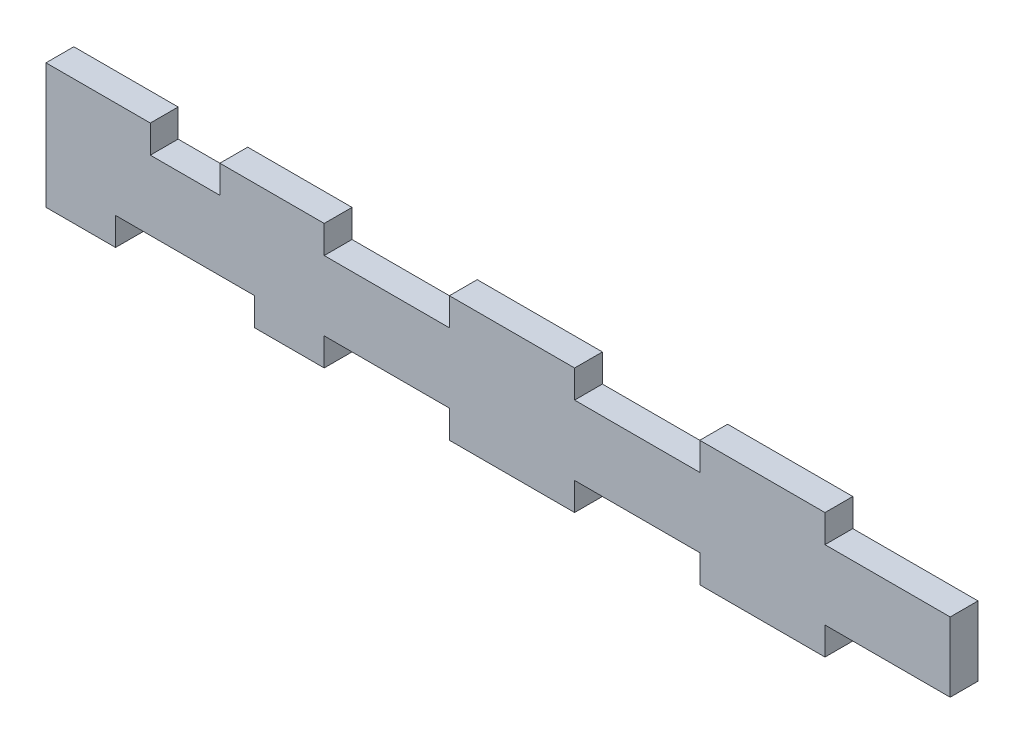
ISO-10303-21;
HEADER;
FILE_DESCRIPTION(('STEP AP214'),'2;1');
FILE_NAME('part.step','',(''),(''),'','','');
FILE_SCHEMA(('AUTOMOTIVE_DESIGN { 1 0 10303 214 1 1 1 1 }'));
ENDSEC;
DATA;
#1=APPLICATION_CONTEXT('core data for automotive mechanical design processes');
#2=APPLICATION_PROTOCOL_DEFINITION('international standard','automotive_design',2000,#1);
#3=PRODUCT_CONTEXT('',#1,'mechanical');
#4=PRODUCT('Part','Part','',(#3));
#5=PRODUCT_RELATED_PRODUCT_CATEGORY('part','',(#4));
#6=PRODUCT_DEFINITION_FORMATION('','',#4);
#7=PRODUCT_DEFINITION_CONTEXT('part definition',#1,'design');
#8=PRODUCT_DEFINITION('design','',#6,#7);
#9=PRODUCT_DEFINITION_SHAPE('','',#8);
#10=(LENGTH_UNIT() NAMED_UNIT(*) SI_UNIT(.MILLI.,.METRE.));
#11=(NAMED_UNIT(*) PLANE_ANGLE_UNIT() SI_UNIT($,.RADIAN.));
#12=(NAMED_UNIT(*) SI_UNIT($,.STERADIAN.) SOLID_ANGLE_UNIT());
#13=UNCERTAINTY_MEASURE_WITH_UNIT(LENGTH_MEASURE(1.E-05),#10,'distance_accuracy_value','');
#14=(GEOMETRIC_REPRESENTATION_CONTEXT(3) GLOBAL_UNCERTAINTY_ASSIGNED_CONTEXT((#13)) GLOBAL_UNIT_ASSIGNED_CONTEXT((#10,
#11,#12)) REPRESENTATION_CONTEXT('',''));
#15=CARTESIAN_POINT('',(0.,0.,0.));
#16=DIRECTION('',(0.,0.,1.));
#17=DIRECTION('',(1.,0.,0.));
#18=AXIS2_PLACEMENT_3D('',#15,#16,#17);
#19=CARTESIAN_POINT('',(-20.,-20.,2.));
#20=DIRECTION('',(0.,1.,0.));
#21=DIRECTION('',(0.,0.,1.));
#22=AXIS2_PLACEMENT_3D('',#19,#20,#21);
#23=PLANE('',#22);
#24=DIRECTION('',(1.,0.,0.));
#25=VECTOR('',#24,1.);
#26=CARTESIAN_POINT('',(-20.,-20.,-2.));
#27=LINE('',#26,#25);
#28=CARTESIAN_POINT('',(-10.,-20.,-2.));
#29=VERTEX_POINT('',#28);
#30=CARTESIAN_POINT('',(9.99999999999999,-20.,-2.));
#31=VERTEX_POINT('',#30);
#32=EDGE_CURVE('E50',#29,#31,#27,.T.);
#33=ORIENTED_EDGE('',*,*,#32,.T.);
#34=DIRECTION('',(0.,0.,1.));
#35=VECTOR('',#34,1.);
#36=CARTESIAN_POINT('',(9.99999999999999,-20.,-2.));
#37=LINE('',#36,#35);
#38=CARTESIAN_POINT('',(9.99999999999999,-20.,2.));
#39=VERTEX_POINT('',#38);
#40=EDGE_CURVE('E446',#31,#39,#37,.T.);
#41=ORIENTED_EDGE('',*,*,#40,.T.);
#42=DIRECTION('',(1.,0.,0.));
#43=VECTOR('',#42,1.);
#44=CARTESIAN_POINT('',(-20.,-20.,2.));
#45=LINE('',#44,#43);
#46=CARTESIAN_POINT('',(-10.,-20.,2.));
#47=VERTEX_POINT('',#46);
#48=EDGE_CURVE('E11',#47,#39,#45,.T.);
#49=ORIENTED_EDGE('',*,*,#48,.F.);
#50=DIRECTION('',(0.,0.,1.));
#51=VECTOR('',#50,1.);
#52=CARTESIAN_POINT('',(-10.,-20.,-2.));
#53=LINE('',#52,#51);
#54=EDGE_CURVE('E475',#29,#47,#53,.T.);
#55=ORIENTED_EDGE('',*,*,#54,.F.);
#56=EDGE_LOOP('',(#33,#41,#49,#55));
#57=FACE_BOUND('',#56,.T.);
#58=ADVANCED_FACE('F46',(#57),#23,.F.);
#59=CARTESIAN_POINT('',(20.,-20.,2.));
#60=DIRECTION('',(-1.,0.,0.));
#61=DIRECTION('',(0.,0.,1.));
#62=AXIS2_PLACEMENT_3D('',#59,#60,#61);
#63=PLANE('',#62);
#64=DIRECTION('',(0.,1.,0.));
#65=VECTOR('',#64,1.);
#66=CARTESIAN_POINT('',(20.,-20.,-2.));
#67=LINE('',#66,#65);
#68=CARTESIAN_POINT('',(20.,-24.,-2.));
#69=VERTEX_POINT('',#68);
#70=CARTESIAN_POINT('',(20.,-20.,-2.));
#71=VERTEX_POINT('',#70);
#72=EDGE_CURVE('E68',#69,#71,#67,.T.);
#73=ORIENTED_EDGE('',*,*,#72,.T.);
#74=DIRECTION('',(0.,0.,1.));
#75=VECTOR('',#74,1.);
#76=CARTESIAN_POINT('',(20.,-20.,-2.));
#77=LINE('',#76,#75);
#78=CARTESIAN_POINT('',(20.,-20.,2.));
#79=VERTEX_POINT('',#78);
#80=EDGE_CURVE('E63',#71,#79,#77,.T.);
#81=ORIENTED_EDGE('',*,*,#80,.T.);
#82=DIRECTION('',(0.,1.,0.));
#83=VECTOR('',#82,1.);
#84=CARTESIAN_POINT('',(20.,-20.,2.));
#85=LINE('',#84,#83);
#86=CARTESIAN_POINT('',(20.,-24.,2.));
#87=VERTEX_POINT('',#86);
#88=EDGE_CURVE('E264',#87,#79,#85,.T.);
#89=ORIENTED_EDGE('',*,*,#88,.F.);
#90=DIRECTION('',(0.,0.,1.));
#91=VECTOR('',#90,1.);
#92=CARTESIAN_POINT('',(20.,-24.,-2.));
#93=LINE('',#92,#91);
#94=EDGE_CURVE('E408',#69,#87,#93,.T.);
#95=ORIENTED_EDGE('',*,*,#94,.F.);
#96=EDGE_LOOP('',(#73,#81,#89,#95));
#97=FACE_BOUND('',#96,.T.);
#98=ADVANCED_FACE('F48',(#97),#63,.F.);
#99=CARTESIAN_POINT('',(-20.,-20.,2.));
#100=DIRECTION('',(1.,0.,0.));
#101=DIRECTION('',(0.,0.,-1.));
#102=AXIS2_PLACEMENT_3D('',#99,#100,#101);
#103=PLANE('',#102);
#104=DIRECTION('',(0.,-1.,0.));
#105=VECTOR('',#104,1.);
#106=CARTESIAN_POINT('',(-20.,-20.,2.));
#107=LINE('',#106,#105);
#108=CARTESIAN_POINT('',(-19.9999999999998,-6.,2.));
#109=VERTEX_POINT('',#108);
#110=CARTESIAN_POINT('',(-20.,-24.,2.));
#111=VERTEX_POINT('',#110);
#112=EDGE_CURVE('E55',#109,#111,#107,.T.);
#113=ORIENTED_EDGE('',*,*,#112,.F.);
#114=DIRECTION('',(0.,0.,1.));
#115=VECTOR('',#114,1.);
#116=CARTESIAN_POINT('',(-19.9999999999998,-6.,-2.));
#117=LINE('',#116,#115);
#118=CARTESIAN_POINT('',(-19.9999999999998,-6.,-2.));
#119=VERTEX_POINT('',#118);
#120=EDGE_CURVE('E258',#119,#109,#117,.T.);
#121=ORIENTED_EDGE('',*,*,#120,.F.);
#122=DIRECTION('',(0.,-1.,0.));
#123=VECTOR('',#122,1.);
#124=CARTESIAN_POINT('',(-20.,-20.,-2.));
#125=LINE('',#124,#123);
#126=CARTESIAN_POINT('',(-20.,-24.,-2.));
#127=VERTEX_POINT('',#126);
#128=EDGE_CURVE('E506',#119,#127,#125,.T.);
#129=ORIENTED_EDGE('',*,*,#128,.T.);
#130=DIRECTION('',(0.,0.,1.));
#131=VECTOR('',#130,1.);
#132=CARTESIAN_POINT('',(-20.,-24.,-2.));
#133=LINE('',#132,#131);
#134=EDGE_CURVE('E260',#127,#111,#133,.T.);
#135=ORIENTED_EDGE('',*,*,#134,.T.);
#136=EDGE_LOOP('',(#113,#121,#129,#135));
#137=FACE_BOUND('',#136,.T.);
#138=ADVANCED_FACE('F256',(#137),#103,.F.);
#139=CARTESIAN_POINT('',(0.,0.,2.));
#140=DIRECTION('',(0.,0.,-1.));
#141=DIRECTION('',(-1.,0.,0.));
#142=AXIS2_PLACEMENT_3D('',#139,#140,#141);
#143=PLANE('',#142);
#144=DIRECTION('',(1.,0.,0.));
#145=VECTOR('',#144,1.);
#146=CARTESIAN_POINT('',(-20.,-6.,2.));
#147=LINE('',#146,#145);
#148=CARTESIAN_POINT('',(-5.,-6.,2.));
#149=VERTEX_POINT('',#148);
#150=EDGE_CURVE('E267',#109,#149,#147,.T.);
#151=ORIENTED_EDGE('',*,*,#150,.F.);
#152=ORIENTED_EDGE('',*,*,#112,.T.);
#153=DIRECTION('',(1.,0.,0.));
#154=VECTOR('',#153,1.);
#155=CARTESIAN_POINT('',(-20.,-24.,2.));
#156=LINE('',#155,#154);
#157=CARTESIAN_POINT('',(-10.,-24.,2.));
#158=VERTEX_POINT('',#157);
#159=EDGE_CURVE('E460',#111,#158,#156,.T.);
#160=ORIENTED_EDGE('',*,*,#159,.T.);
#161=DIRECTION('',(0.,1.,0.));
#162=VECTOR('',#161,1.);
#163=CARTESIAN_POINT('',(-10.,-20.,2.));
#164=LINE('',#163,#162);
#165=EDGE_CURVE('E469',#158,#47,#164,.T.);
#166=ORIENTED_EDGE('',*,*,#165,.T.);
#167=ORIENTED_EDGE('',*,*,#48,.T.);
#168=DIRECTION('',(0.,-1.,0.));
#169=VECTOR('',#168,1.);
#170=CARTESIAN_POINT('',(9.99999999999999,-20.,2.));
#171=LINE('',#170,#169);
#172=CARTESIAN_POINT('',(9.99999999999999,-24.,2.));
#173=VERTEX_POINT('',#172);
#174=EDGE_CURVE('E456',#39,#173,#171,.T.);
#175=ORIENTED_EDGE('',*,*,#174,.T.);
#176=DIRECTION('',(1.,0.,0.));
#177=VECTOR('',#176,1.);
#178=CARTESIAN_POINT('',(20.,-24.,2.));
#179=LINE('',#178,#177);
#180=EDGE_CURVE('E453',#173,#87,#179,.T.);
#181=ORIENTED_EDGE('',*,*,#180,.T.);
#182=ORIENTED_EDGE('',*,*,#88,.T.);
#183=DIRECTION('',(1.,0.,0.));
#184=VECTOR('',#183,1.);
#185=CARTESIAN_POINT('',(20.,-20.,2.));
#186=LINE('',#185,#184);
#187=CARTESIAN_POINT('',(38.0000000000002,-20.,2.));
#188=VERTEX_POINT('',#187);
#189=EDGE_CURVE('E350',#79,#188,#186,.T.);
#190=ORIENTED_EDGE('',*,*,#189,.T.);
#191=DIRECTION('',(0.,-1.,0.));
#192=VECTOR('',#191,1.);
#193=CARTESIAN_POINT('',(38.0000000000002,-20.,2.));
#194=LINE('',#193,#192);
#195=CARTESIAN_POINT('',(38.0000000000002,-24.,2.));
#196=VERTEX_POINT('',#195);
#197=EDGE_CURVE('E353',#188,#196,#194,.T.);
#198=ORIENTED_EDGE('',*,*,#197,.T.);
#199=DIRECTION('',(1.,0.,0.));
#200=VECTOR('',#199,1.);
#201=CARTESIAN_POINT('',(38.0000000000002,-24.,2.));
#202=LINE('',#201,#200);
#203=CARTESIAN_POINT('',(56.0000000000002,-24.,2.));
#204=VERTEX_POINT('',#203);
#205=EDGE_CURVE('E356',#196,#204,#202,.T.);
#206=ORIENTED_EDGE('',*,*,#205,.T.);
#207=DIRECTION('',(0.,1.,0.));
#208=VECTOR('',#207,1.);
#209=CARTESIAN_POINT('',(56.0000000000002,-20.,2.));
#210=LINE('',#209,#208);
#211=CARTESIAN_POINT('',(56.0000000000002,-20.,2.));
#212=VERTEX_POINT('',#211);
#213=EDGE_CURVE('E359',#204,#212,#210,.T.);
#214=ORIENTED_EDGE('',*,*,#213,.T.);
#215=DIRECTION('',(1.,0.,0.));
#216=VECTOR('',#215,1.);
#217=CARTESIAN_POINT('',(56.0000000000002,-20.,2.));
#218=LINE('',#217,#216);
#219=CARTESIAN_POINT('',(74.0000000000002,-20.,2.));
#220=VERTEX_POINT('',#219);
#221=EDGE_CURVE('E362',#212,#220,#218,.T.);
#222=ORIENTED_EDGE('',*,*,#221,.T.);
#223=DIRECTION('',(0.,-1.,0.));
#224=VECTOR('',#223,1.);
#225=CARTESIAN_POINT('',(74.0000000000002,-20.,2.));
#226=LINE('',#225,#224);
#227=CARTESIAN_POINT('',(74.0000000000002,-24.,2.));
#228=VERTEX_POINT('',#227);
#229=EDGE_CURVE('E365',#220,#228,#226,.T.);
#230=ORIENTED_EDGE('',*,*,#229,.T.);
#231=DIRECTION('',(1.,0.,0.));
#232=VECTOR('',#231,1.);
#233=CARTESIAN_POINT('',(74.0000000000002,-24.,2.));
#234=LINE('',#233,#232);
#235=CARTESIAN_POINT('',(92.0000000000002,-24.,2.));
#236=VERTEX_POINT('',#235);
#237=EDGE_CURVE('E368',#228,#236,#234,.T.);
#238=ORIENTED_EDGE('',*,*,#237,.T.);
#239=DIRECTION('',(0.,1.,0.));
#240=VECTOR('',#239,1.);
#241=CARTESIAN_POINT('',(92.0000000000002,-20.,2.));
#242=LINE('',#241,#240);
#243=CARTESIAN_POINT('',(92.0000000000002,-20.,2.));
#244=VERTEX_POINT('',#243);
#245=EDGE_CURVE('E371',#236,#244,#242,.T.);
#246=ORIENTED_EDGE('',*,*,#245,.T.);
#247=DIRECTION('',(1.,0.,0.));
#248=VECTOR('',#247,1.);
#249=CARTESIAN_POINT('',(92.0000000000002,-20.,2.));
#250=LINE('',#249,#248);
#251=CARTESIAN_POINT('',(110.,-20.,2.));
#252=VERTEX_POINT('',#251);
#253=EDGE_CURVE('E374',#244,#252,#250,.T.);
#254=ORIENTED_EDGE('',*,*,#253,.T.);
#255=DIRECTION('',(0.,1.,0.));
#256=VECTOR('',#255,1.);
#257=CARTESIAN_POINT('',(110.,-20.,2.));
#258=LINE('',#257,#256);
#259=CARTESIAN_POINT('',(110.,-10.,2.));
#260=VERTEX_POINT('',#259);
#261=EDGE_CURVE('E377',#252,#260,#258,.T.);
#262=ORIENTED_EDGE('',*,*,#261,.T.);
#263=DIRECTION('',(-1.,0.,0.));
#264=VECTOR('',#263,1.);
#265=CARTESIAN_POINT('',(92.0000000000002,-10.,2.));
#266=LINE('',#265,#264);
#267=CARTESIAN_POINT('',(92.0000000000002,-10.,2.));
#268=VERTEX_POINT('',#267);
#269=EDGE_CURVE('E380',#260,#268,#266,.T.);
#270=ORIENTED_EDGE('',*,*,#269,.T.);
#271=DIRECTION('',(0.,1.,0.));
#272=VECTOR('',#271,1.);
#273=CARTESIAN_POINT('',(92.0000000000002,-10.,2.));
#274=LINE('',#273,#272);
#275=CARTESIAN_POINT('',(92.0000000000002,-6.,2.));
#276=VERTEX_POINT('',#275);
#277=EDGE_CURVE('E383',#268,#276,#274,.T.);
#278=ORIENTED_EDGE('',*,*,#277,.T.);
#279=DIRECTION('',(-1.,0.,0.));
#280=VECTOR('',#279,1.);
#281=CARTESIAN_POINT('',(74.0000000000002,-6.,2.));
#282=LINE('',#281,#280);
#283=CARTESIAN_POINT('',(74.0000000000002,-6.,2.));
#284=VERTEX_POINT('',#283);
#285=EDGE_CURVE('E386',#276,#284,#282,.T.);
#286=ORIENTED_EDGE('',*,*,#285,.T.);
#287=DIRECTION('',(0.,-1.,0.));
#288=VECTOR('',#287,1.);
#289=CARTESIAN_POINT('',(74.0000000000002,-10.,2.));
#290=LINE('',#289,#288);
#291=CARTESIAN_POINT('',(74.0000000000002,-10.,2.));
#292=VERTEX_POINT('',#291);
#293=EDGE_CURVE('E389',#284,#292,#290,.T.);
#294=ORIENTED_EDGE('',*,*,#293,.T.);
#295=DIRECTION('',(-1.,0.,0.));
#296=VECTOR('',#295,1.);
#297=CARTESIAN_POINT('',(56.0000000000002,-10.,2.));
#298=LINE('',#297,#296);
#299=CARTESIAN_POINT('',(56.0000000000002,-10.,2.));
#300=VERTEX_POINT('',#299);
#301=EDGE_CURVE('E392',#292,#300,#298,.T.);
#302=ORIENTED_EDGE('',*,*,#301,.T.);
#303=DIRECTION('',(0.,1.,0.));
#304=VECTOR('',#303,1.);
#305=CARTESIAN_POINT('',(56.0000000000002,-10.,2.));
#306=LINE('',#305,#304);
#307=CARTESIAN_POINT('',(56.0000000000002,-6.,2.));
#308=VERTEX_POINT('',#307);
#309=EDGE_CURVE('E395',#300,#308,#306,.T.);
#310=ORIENTED_EDGE('',*,*,#309,.T.);
#311=DIRECTION('',(-1.,0.,0.));
#312=VECTOR('',#311,1.);
#313=CARTESIAN_POINT('',(38.0000000000002,-6.,2.));
#314=LINE('',#313,#312);
#315=CARTESIAN_POINT('',(38.0000000000002,-6.,2.));
#316=VERTEX_POINT('',#315);
#317=EDGE_CURVE('E398',#308,#316,#314,.T.);
#318=ORIENTED_EDGE('',*,*,#317,.T.);
#319=DIRECTION('',(0.,-1.,0.));
#320=VECTOR('',#319,1.);
#321=CARTESIAN_POINT('',(38.0000000000002,-10.,2.));
#322=LINE('',#321,#320);
#323=CARTESIAN_POINT('',(38.0000000000002,-10.,2.));
#324=VERTEX_POINT('',#323);
#325=EDGE_CURVE('E401',#316,#324,#322,.T.);
#326=ORIENTED_EDGE('',*,*,#325,.T.);
#327=DIRECTION('',(-1.,0.,0.));
#328=VECTOR('',#327,1.);
#329=CARTESIAN_POINT('',(20.,-10.,2.));
#330=LINE('',#329,#328);
#331=CARTESIAN_POINT('',(20.,-10.,2.));
#332=VERTEX_POINT('',#331);
#333=EDGE_CURVE('E297',#324,#332,#330,.T.);
#334=ORIENTED_EDGE('',*,*,#333,.T.);
#335=DIRECTION('',(0.,1.,0.));
#336=VECTOR('',#335,1.);
#337=CARTESIAN_POINT('',(20.,-15.,2.));
#338=LINE('',#337,#336);
#339=CARTESIAN_POINT('',(20.,-6.,2.));
#340=VERTEX_POINT('',#339);
#341=EDGE_CURVE('E281',#332,#340,#338,.T.);
#342=ORIENTED_EDGE('',*,*,#341,.T.);
#343=CARTESIAN_POINT('',(5.,-6.,2.));
#344=VERTEX_POINT('',#343);
#345=EDGE_CURVE('E275',#344,#340,#147,.T.);
#346=ORIENTED_EDGE('',*,*,#345,.F.);
#347=DIRECTION('',(0.,1.,0.));
#348=VECTOR('',#347,1.);
#349=CARTESIAN_POINT('',(5.,-10.,2.));
#350=LINE('',#349,#348);
#351=CARTESIAN_POINT('',(5.,-10.,2.));
#352=VERTEX_POINT('',#351);
#353=EDGE_CURVE('E495',#352,#344,#350,.T.);
#354=ORIENTED_EDGE('',*,*,#353,.F.);
#355=DIRECTION('',(1.,0.,0.));
#356=VECTOR('',#355,1.);
#357=CARTESIAN_POINT('',(-5.,-9.99999999999999,2.));
#358=LINE('',#357,#356);
#359=CARTESIAN_POINT('',(-5.,-9.99999999999999,2.));
#360=VERTEX_POINT('',#359);
#361=EDGE_CURVE('E490',#360,#352,#358,.T.);
#362=ORIENTED_EDGE('',*,*,#361,.F.);
#363=DIRECTION('',(0.,-1.,0.));
#364=VECTOR('',#363,1.);
#365=CARTESIAN_POINT('',(-5.,-9.99999999999999,2.));
#366=LINE('',#365,#364);
#367=EDGE_CURVE('E271',#149,#360,#366,.T.);
#368=ORIENTED_EDGE('',*,*,#367,.F.);
#369=EDGE_LOOP('',(#151,#152,#160,#166,#167,#175,#181,#182,#190,#198,#206,#214,#222,#230,#238,
#246,#254,#262,#270,#278,#286,#294,#302,#310,#318,#326,#334,#342,#346,#354,#362,#368));
#370=FACE_BOUND('',#369,.T.);
#371=ADVANCED_FACE('F268',(#370),#143,.F.);
#372=CARTESIAN_POINT('',(0.,0.,-2.));
#373=DIRECTION('',(0.,0.,-1.));
#374=DIRECTION('',(-1.,0.,0.));
#375=AXIS2_PLACEMENT_3D('',#372,#373,#374);
#376=PLANE('',#375);
#377=ORIENTED_EDGE('',*,*,#128,.F.);
#378=DIRECTION('',(1.,0.,0.));
#379=VECTOR('',#378,1.);
#380=CARTESIAN_POINT('',(-20.,-6.,-2.));
#381=LINE('',#380,#379);
#382=CARTESIAN_POINT('',(-5.,-6.,-2.));
#383=VERTEX_POINT('',#382);
#384=EDGE_CURVE('E280',#119,#383,#381,.T.);
#385=ORIENTED_EDGE('',*,*,#384,.T.);
#386=DIRECTION('',(0.,-1.,0.));
#387=VECTOR('',#386,1.);
#388=CARTESIAN_POINT('',(-5.,-9.99999999999999,-2.));
#389=LINE('',#388,#387);
#390=CARTESIAN_POINT('',(-5.,-9.99999999999999,-2.));
#391=VERTEX_POINT('',#390);
#392=EDGE_CURVE('E500',#383,#391,#389,.T.);
#393=ORIENTED_EDGE('',*,*,#392,.T.);
#394=DIRECTION('',(1.,0.,0.));
#395=VECTOR('',#394,1.);
#396=CARTESIAN_POINT('',(-5.,-9.99999999999999,-2.));
#397=LINE('',#396,#395);
#398=CARTESIAN_POINT('',(5.,-10.,-2.));
#399=VERTEX_POINT('',#398);
#400=EDGE_CURVE('E484',#391,#399,#397,.T.);
#401=ORIENTED_EDGE('',*,*,#400,.T.);
#402=DIRECTION('',(0.,1.,0.));
#403=VECTOR('',#402,1.);
#404=CARTESIAN_POINT('',(5.,-10.,-2.));
#405=LINE('',#404,#403);
#406=CARTESIAN_POINT('',(5.,-6.,-2.));
#407=VERTEX_POINT('',#406);
#408=EDGE_CURVE('E493',#399,#407,#405,.T.);
#409=ORIENTED_EDGE('',*,*,#408,.T.);
#410=CARTESIAN_POINT('',(20.,-6.,-2.));
#411=VERTEX_POINT('',#410);
#412=EDGE_CURVE('E274',#407,#411,#381,.T.);
#413=ORIENTED_EDGE('',*,*,#412,.T.);
#414=DIRECTION('',(0.,1.,0.));
#415=VECTOR('',#414,1.);
#416=CARTESIAN_POINT('',(20.,-15.,-2.));
#417=LINE('',#416,#415);
#418=CARTESIAN_POINT('',(20.,-10.,-2.));
#419=VERTEX_POINT('',#418);
#420=EDGE_CURVE('E284',#419,#411,#417,.T.);
#421=ORIENTED_EDGE('',*,*,#420,.F.);
#422=DIRECTION('',(-1.,0.,0.));
#423=VECTOR('',#422,1.);
#424=CARTESIAN_POINT('',(20.,-10.,-2.));
#425=LINE('',#424,#423);
#426=CARTESIAN_POINT('',(38.0000000000002,-10.,-2.));
#427=VERTEX_POINT('',#426);
#428=EDGE_CURVE('E348',#427,#419,#425,.T.);
#429=ORIENTED_EDGE('',*,*,#428,.F.);
#430=DIRECTION('',(0.,-1.,0.));
#431=VECTOR('',#430,1.);
#432=CARTESIAN_POINT('',(38.0000000000002,-10.,-2.));
#433=LINE('',#432,#431);
#434=CARTESIAN_POINT('',(38.0000000000002,-6.,-2.));
#435=VERTEX_POINT('',#434);
#436=EDGE_CURVE('E345',#435,#427,#433,.T.);
#437=ORIENTED_EDGE('',*,*,#436,.F.);
#438=DIRECTION('',(-1.,0.,0.));
#439=VECTOR('',#438,1.);
#440=CARTESIAN_POINT('',(38.0000000000002,-6.,-2.));
#441=LINE('',#440,#439);
#442=CARTESIAN_POINT('',(56.0000000000002,-6.,-2.));
#443=VERTEX_POINT('',#442);
#444=EDGE_CURVE('E342',#443,#435,#441,.T.);
#445=ORIENTED_EDGE('',*,*,#444,.F.);
#446=DIRECTION('',(0.,1.,0.));
#447=VECTOR('',#446,1.);
#448=CARTESIAN_POINT('',(56.0000000000002,-10.,-2.));
#449=LINE('',#448,#447);
#450=CARTESIAN_POINT('',(56.0000000000002,-10.,-2.));
#451=VERTEX_POINT('',#450);
#452=EDGE_CURVE('E339',#451,#443,#449,.T.);
#453=ORIENTED_EDGE('',*,*,#452,.F.);
#454=DIRECTION('',(-1.,0.,0.));
#455=VECTOR('',#454,1.);
#456=CARTESIAN_POINT('',(56.0000000000002,-10.,-2.));
#457=LINE('',#456,#455);
#458=CARTESIAN_POINT('',(74.0000000000002,-10.,-2.));
#459=VERTEX_POINT('',#458);
#460=EDGE_CURVE('E336',#459,#451,#457,.T.);
#461=ORIENTED_EDGE('',*,*,#460,.F.);
#462=DIRECTION('',(0.,-1.,0.));
#463=VECTOR('',#462,1.);
#464=CARTESIAN_POINT('',(74.0000000000002,-10.,-2.));
#465=LINE('',#464,#463);
#466=CARTESIAN_POINT('',(74.0000000000002,-6.,-2.));
#467=VERTEX_POINT('',#466);
#468=EDGE_CURVE('E333',#467,#459,#465,.T.);
#469=ORIENTED_EDGE('',*,*,#468,.F.);
#470=DIRECTION('',(-1.,0.,0.));
#471=VECTOR('',#470,1.);
#472=CARTESIAN_POINT('',(74.0000000000002,-6.,-2.));
#473=LINE('',#472,#471);
#474=CARTESIAN_POINT('',(92.0000000000002,-6.,-2.));
#475=VERTEX_POINT('',#474);
#476=EDGE_CURVE('E330',#475,#467,#473,.T.);
#477=ORIENTED_EDGE('',*,*,#476,.F.);
#478=DIRECTION('',(0.,1.,0.));
#479=VECTOR('',#478,1.);
#480=CARTESIAN_POINT('',(92.0000000000002,-10.,-2.));
#481=LINE('',#480,#479);
#482=CARTESIAN_POINT('',(92.0000000000002,-10.,-2.));
#483=VERTEX_POINT('',#482);
#484=EDGE_CURVE('E327',#483,#475,#481,.T.);
#485=ORIENTED_EDGE('',*,*,#484,.F.);
#486=DIRECTION('',(-1.,0.,0.));
#487=VECTOR('',#486,1.);
#488=CARTESIAN_POINT('',(92.0000000000002,-10.,-2.));
#489=LINE('',#488,#487);
#490=CARTESIAN_POINT('',(110.,-10.,-2.));
#491=VERTEX_POINT('',#490);
#492=EDGE_CURVE('E324',#491,#483,#489,.T.);
#493=ORIENTED_EDGE('',*,*,#492,.F.);
#494=DIRECTION('',(0.,1.,0.));
#495=VECTOR('',#494,1.);
#496=CARTESIAN_POINT('',(110.,-20.,-2.));
#497=LINE('',#496,#495);
#498=CARTESIAN_POINT('',(110.,-20.,-2.));
#499=VERTEX_POINT('',#498);
#500=EDGE_CURVE('E321',#499,#491,#497,.T.);
#501=ORIENTED_EDGE('',*,*,#500,.F.);
#502=DIRECTION('',(1.,0.,0.));
#503=VECTOR('',#502,1.);
#504=CARTESIAN_POINT('',(92.0000000000002,-20.,-2.));
#505=LINE('',#504,#503);
#506=CARTESIAN_POINT('',(92.0000000000002,-20.,-2.));
#507=VERTEX_POINT('',#506);
#508=EDGE_CURVE('E318',#507,#499,#505,.T.);
#509=ORIENTED_EDGE('',*,*,#508,.F.);
#510=DIRECTION('',(0.,1.,0.));
#511=VECTOR('',#510,1.);
#512=CARTESIAN_POINT('',(92.0000000000002,-20.,-2.));
#513=LINE('',#512,#511);
#514=CARTESIAN_POINT('',(92.0000000000002,-24.,-2.));
#515=VERTEX_POINT('',#514);
#516=EDGE_CURVE('E315',#515,#507,#513,.T.);
#517=ORIENTED_EDGE('',*,*,#516,.F.);
#518=DIRECTION('',(1.,0.,0.));
#519=VECTOR('',#518,1.);
#520=CARTESIAN_POINT('',(74.0000000000002,-24.,-2.));
#521=LINE('',#520,#519);
#522=CARTESIAN_POINT('',(74.0000000000002,-24.,-2.));
#523=VERTEX_POINT('',#522);
#524=EDGE_CURVE('E312',#523,#515,#521,.T.);
#525=ORIENTED_EDGE('',*,*,#524,.F.);
#526=DIRECTION('',(0.,-1.,0.));
#527=VECTOR('',#526,1.);
#528=CARTESIAN_POINT('',(74.0000000000002,-20.,-2.));
#529=LINE('',#528,#527);
#530=CARTESIAN_POINT('',(74.0000000000002,-20.,-2.));
#531=VERTEX_POINT('',#530);
#532=EDGE_CURVE('E309',#531,#523,#529,.T.);
#533=ORIENTED_EDGE('',*,*,#532,.F.);
#534=DIRECTION('',(1.,0.,0.));
#535=VECTOR('',#534,1.);
#536=CARTESIAN_POINT('',(56.0000000000002,-20.,-2.));
#537=LINE('',#536,#535);
#538=CARTESIAN_POINT('',(56.0000000000002,-20.,-2.));
#539=VERTEX_POINT('',#538);
#540=EDGE_CURVE('E306',#539,#531,#537,.T.);
#541=ORIENTED_EDGE('',*,*,#540,.F.);
#542=DIRECTION('',(0.,1.,0.));
#543=VECTOR('',#542,1.);
#544=CARTESIAN_POINT('',(56.0000000000002,-20.,-2.));
#545=LINE('',#544,#543);
#546=CARTESIAN_POINT('',(56.0000000000002,-24.,-2.));
#547=VERTEX_POINT('',#546);
#548=EDGE_CURVE('E303',#547,#539,#545,.T.);
#549=ORIENTED_EDGE('',*,*,#548,.F.);
#550=DIRECTION('',(1.,0.,0.));
#551=VECTOR('',#550,1.);
#552=CARTESIAN_POINT('',(38.0000000000002,-24.,-2.));
#553=LINE('',#552,#551);
#554=CARTESIAN_POINT('',(38.0000000000002,-24.,-2.));
#555=VERTEX_POINT('',#554);
#556=EDGE_CURVE('E300',#555,#547,#553,.T.);
#557=ORIENTED_EDGE('',*,*,#556,.F.);
#558=DIRECTION('',(0.,-1.,0.));
#559=VECTOR('',#558,1.);
#560=CARTESIAN_POINT('',(38.0000000000002,-20.,-2.));
#561=LINE('',#560,#559);
#562=CARTESIAN_POINT('',(38.0000000000002,-20.,-2.));
#563=VERTEX_POINT('',#562);
#564=EDGE_CURVE('E296',#563,#555,#561,.T.);
#565=ORIENTED_EDGE('',*,*,#564,.F.);
#566=DIRECTION('',(1.,0.,0.));
#567=VECTOR('',#566,1.);
#568=CARTESIAN_POINT('',(20.,-20.,-2.));
#569=LINE('',#568,#567);
#570=EDGE_CURVE('E293',#71,#563,#569,.T.);
#571=ORIENTED_EDGE('',*,*,#570,.F.);
#572=ORIENTED_EDGE('',*,*,#72,.F.);
#573=DIRECTION('',(1.,0.,0.));
#574=VECTOR('',#573,1.);
#575=CARTESIAN_POINT('',(20.,-24.,-2.));
#576=LINE('',#575,#574);
#577=CARTESIAN_POINT('',(9.99999999999999,-24.,-2.));
#578=VERTEX_POINT('',#577);
#579=EDGE_CURVE('E448',#578,#69,#576,.T.);
#580=ORIENTED_EDGE('',*,*,#579,.F.);
#581=DIRECTION('',(0.,-1.,0.));
#582=VECTOR('',#581,1.);
#583=CARTESIAN_POINT('',(9.99999999999999,-20.,-2.));
#584=LINE('',#583,#582);
#585=EDGE_CURVE('E457',#31,#578,#584,.T.);
#586=ORIENTED_EDGE('',*,*,#585,.F.);
#587=ORIENTED_EDGE('',*,*,#32,.F.);
#588=DIRECTION('',(0.,1.,0.));
#589=VECTOR('',#588,1.);
#590=CARTESIAN_POINT('',(-10.,-20.,-2.));
#591=LINE('',#590,#589);
#592=CARTESIAN_POINT('',(-10.,-24.,-2.));
#593=VERTEX_POINT('',#592);
#594=EDGE_CURVE('E468',#593,#29,#591,.T.);
#595=ORIENTED_EDGE('',*,*,#594,.F.);
#596=DIRECTION('',(1.,0.,0.));
#597=VECTOR('',#596,1.);
#598=CARTESIAN_POINT('',(-20.,-24.,-2.));
#599=LINE('',#598,#597);
#600=EDGE_CURVE('E465',#127,#593,#599,.T.);
#601=ORIENTED_EDGE('',*,*,#600,.F.);
#602=EDGE_LOOP('',(#377,#385,#393,#401,#409,#413,#421,#429,#437,#445,#453,#461,#469,#477,#485,
#493,#501,#509,#517,#525,#533,#541,#549,#557,#565,#571,#572,#580,#586,#587,#595,#601));
#603=FACE_BOUND('',#602,.T.);
#604=ADVANCED_FACE('F517',(#603),#376,.T.);
#605=CARTESIAN_POINT('',(5.,-10.,-2.));
#606=DIRECTION('',(1.,0.,0.));
#607=DIRECTION('',(0.,0.,-1.));
#608=AXIS2_PLACEMENT_3D('',#605,#606,#607);
#609=PLANE('',#608);
#610=ORIENTED_EDGE('',*,*,#353,.T.);
#611=DIRECTION('',(0.,0.,1.));
#612=VECTOR('',#611,1.);
#613=CARTESIAN_POINT('',(5.,-6.,-2.));
#614=LINE('',#613,#612);
#615=EDGE_CURVE('E482',#407,#344,#614,.T.);
#616=ORIENTED_EDGE('',*,*,#615,.F.);
#617=ORIENTED_EDGE('',*,*,#408,.F.);
#618=DIRECTION('',(0.,0.,1.));
#619=VECTOR('',#618,1.);
#620=CARTESIAN_POINT('',(5.,-10.,-2.));
#621=LINE('',#620,#619);
#622=EDGE_CURVE('E478',#399,#352,#621,.T.);
#623=ORIENTED_EDGE('',*,*,#622,.T.);
#624=EDGE_LOOP('',(#610,#616,#617,#623));
#625=FACE_BOUND('',#624,.T.);
#626=ADVANCED_FACE('F552',(#625),#609,.F.);
#627=CARTESIAN_POINT('',(-5.,-9.99999999999999,-2.));
#628=DIRECTION('',(0.,-1.,0.));
#629=DIRECTION('',(1.,0.,0.));
#630=AXIS2_PLACEMENT_3D('',#627,#628,#629);
#631=PLANE('',#630);
#632=ORIENTED_EDGE('',*,*,#361,.T.);
#633=ORIENTED_EDGE('',*,*,#622,.F.);
#634=ORIENTED_EDGE('',*,*,#400,.F.);
#635=DIRECTION('',(0.,0.,1.));
#636=VECTOR('',#635,1.);
#637=CARTESIAN_POINT('',(-5.,-9.99999999999999,-2.));
#638=LINE('',#637,#636);
#639=EDGE_CURVE('E487',#391,#360,#638,.T.);
#640=ORIENTED_EDGE('',*,*,#639,.T.);
#641=EDGE_LOOP('',(#632,#633,#634,#640));
#642=FACE_BOUND('',#641,.T.);
#643=ADVANCED_FACE('F554',(#642),#631,.F.);
#644=CARTESIAN_POINT('',(-5.,-9.99999999999999,-2.));
#645=DIRECTION('',(-1.,0.,0.));
#646=DIRECTION('',(0.,0.,1.));
#647=AXIS2_PLACEMENT_3D('',#644,#645,#646);
#648=PLANE('',#647);
#649=ORIENTED_EDGE('',*,*,#367,.T.);
#650=ORIENTED_EDGE('',*,*,#639,.F.);
#651=ORIENTED_EDGE('',*,*,#392,.F.);
#652=DIRECTION('',(0.,0.,1.));
#653=VECTOR('',#652,1.);
#654=CARTESIAN_POINT('',(-5.,-6.,-2.));
#655=LINE('',#654,#653);
#656=EDGE_CURVE('E485',#383,#149,#655,.T.);
#657=ORIENTED_EDGE('',*,*,#656,.T.);
#658=EDGE_LOOP('',(#649,#650,#651,#657));
#659=FACE_BOUND('',#658,.T.);
#660=ADVANCED_FACE('F535',(#659),#648,.F.);
#661=CARTESIAN_POINT('',(-10.,-20.,-2.));
#662=DIRECTION('',(1.,0.,0.));
#663=DIRECTION('',(0.,0.,-1.));
#664=AXIS2_PLACEMENT_3D('',#661,#662,#663);
#665=PLANE('',#664);
#666=ORIENTED_EDGE('',*,*,#165,.F.);
#667=DIRECTION('',(0.,0.,1.));
#668=VECTOR('',#667,1.);
#669=CARTESIAN_POINT('',(-10.,-24.,-2.));
#670=LINE('',#669,#668);
#671=EDGE_CURVE('E479',#593,#158,#670,.T.);
#672=ORIENTED_EDGE('',*,*,#671,.F.);
#673=ORIENTED_EDGE('',*,*,#594,.T.);
#674=ORIENTED_EDGE('',*,*,#54,.T.);
#675=EDGE_LOOP('',(#666,#672,#673,#674));
#676=FACE_BOUND('',#675,.T.);
#677=ADVANCED_FACE('F524',(#676),#665,.T.);
#678=CARTESIAN_POINT('',(-20.,-24.,-2.));
#679=DIRECTION('',(0.,-1.,0.));
#680=DIRECTION('',(0.,0.,-1.));
#681=AXIS2_PLACEMENT_3D('',#678,#679,#680);
#682=PLANE('',#681);
#683=ORIENTED_EDGE('',*,*,#159,.F.);
#684=ORIENTED_EDGE('',*,*,#134,.F.);
#685=ORIENTED_EDGE('',*,*,#600,.T.);
#686=ORIENTED_EDGE('',*,*,#671,.T.);
#687=EDGE_LOOP('',(#683,#684,#685,#686));
#688=FACE_BOUND('',#687,.T.);
#689=ADVANCED_FACE('F527',(#688),#682,.T.);
#690=CARTESIAN_POINT('',(20.,-24.,-2.));
#691=DIRECTION('',(0.,-1.,0.));
#692=DIRECTION('',(1.,0.,0.));
#693=AXIS2_PLACEMENT_3D('',#690,#691,#692);
#694=PLANE('',#693);
#695=ORIENTED_EDGE('',*,*,#180,.F.);
#696=DIRECTION('',(0.,0.,1.));
#697=VECTOR('',#696,1.);
#698=CARTESIAN_POINT('',(9.99999999999999,-24.,-2.));
#699=LINE('',#698,#697);
#700=EDGE_CURVE('E449',#578,#173,#699,.T.);
#701=ORIENTED_EDGE('',*,*,#700,.F.);
#702=ORIENTED_EDGE('',*,*,#579,.T.);
#703=ORIENTED_EDGE('',*,*,#94,.T.);
#704=EDGE_LOOP('',(#695,#701,#702,#703));
#705=FACE_BOUND('',#704,.T.);
#706=ADVANCED_FACE('F521',(#705),#694,.T.);
#707=CARTESIAN_POINT('',(9.99999999999999,-20.,-2.));
#708=DIRECTION('',(-1.,0.,0.));
#709=DIRECTION('',(0.,0.,1.));
#710=AXIS2_PLACEMENT_3D('',#707,#708,#709);
#711=PLANE('',#710);
#712=ORIENTED_EDGE('',*,*,#174,.F.);
#713=ORIENTED_EDGE('',*,*,#40,.F.);
#714=ORIENTED_EDGE('',*,*,#585,.T.);
#715=ORIENTED_EDGE('',*,*,#700,.T.);
#716=EDGE_LOOP('',(#712,#713,#714,#715));
#717=FACE_BOUND('',#716,.T.);
#718=ADVANCED_FACE('F515',(#717),#711,.T.);
#719=CARTESIAN_POINT('',(20.,-10.,-2.));
#720=DIRECTION('',(0.,1.,0.));
#721=DIRECTION('',(0.,0.,1.));
#722=AXIS2_PLACEMENT_3D('',#719,#720,#721);
#723=PLANE('',#722);
#724=ORIENTED_EDGE('',*,*,#333,.F.);
#725=DIRECTION('',(0.,0.,1.));
#726=VECTOR('',#725,1.);
#727=CARTESIAN_POINT('',(38.0000000000002,-10.,-2.));
#728=LINE('',#727,#726);
#729=EDGE_CURVE('E409',#427,#324,#728,.T.);
#730=ORIENTED_EDGE('',*,*,#729,.F.);
#731=ORIENTED_EDGE('',*,*,#428,.T.);
#732=DIRECTION('',(0.,0.,1.));
#733=VECTOR('',#732,1.);
#734=CARTESIAN_POINT('',(20.,-10.,-2.));
#735=LINE('',#734,#733);
#736=EDGE_CURVE('E406',#419,#332,#735,.T.);
#737=ORIENTED_EDGE('',*,*,#736,.T.);
#738=EDGE_LOOP('',(#724,#730,#731,#737));
#739=FACE_BOUND('',#738,.T.);
#740=ADVANCED_FACE('F579',(#739),#723,.T.);
#741=CARTESIAN_POINT('',(38.0000000000002,-10.,-2.));
#742=DIRECTION('',(-1.,0.,0.));
#743=DIRECTION('',(0.,0.,1.));
#744=AXIS2_PLACEMENT_3D('',#741,#742,#743);
#745=PLANE('',#744);
#746=ORIENTED_EDGE('',*,*,#325,.F.);
#747=DIRECTION('',(0.,0.,1.));
#748=VECTOR('',#747,1.);
#749=CARTESIAN_POINT('',(38.0000000000002,-6.,-2.));
#750=LINE('',#749,#748);
#751=EDGE_CURVE('E411',#435,#316,#750,.T.);
#752=ORIENTED_EDGE('',*,*,#751,.F.);
#753=ORIENTED_EDGE('',*,*,#436,.T.);
#754=ORIENTED_EDGE('',*,*,#729,.T.);
#755=EDGE_LOOP('',(#746,#752,#753,#754));
#756=FACE_BOUND('',#755,.T.);
#757=ADVANCED_FACE('F583',(#756),#745,.T.);
#758=CARTESIAN_POINT('',(38.0000000000002,-6.,-2.));
#759=DIRECTION('',(0.,1.,0.));
#760=DIRECTION('',(0.,0.,1.));
#761=AXIS2_PLACEMENT_3D('',#758,#759,#760);
#762=PLANE('',#761);
#763=ORIENTED_EDGE('',*,*,#317,.F.);
#764=DIRECTION('',(0.,0.,1.));
#765=VECTOR('',#764,1.);
#766=CARTESIAN_POINT('',(56.0000000000002,-6.,-2.));
#767=LINE('',#766,#765);
#768=EDGE_CURVE('E413',#443,#308,#767,.T.);
#769=ORIENTED_EDGE('',*,*,#768,.F.);
#770=ORIENTED_EDGE('',*,*,#444,.T.);
#771=ORIENTED_EDGE('',*,*,#751,.T.);
#772=EDGE_LOOP('',(#763,#769,#770,#771));
#773=FACE_BOUND('',#772,.T.);
#774=ADVANCED_FACE('F588',(#773),#762,.T.);
#775=CARTESIAN_POINT('',(56.0000000000002,-10.,-2.));
#776=DIRECTION('',(1.,0.,0.));
#777=DIRECTION('',(0.,0.,-1.));
#778=AXIS2_PLACEMENT_3D('',#775,#776,#777);
#779=PLANE('',#778);
#780=ORIENTED_EDGE('',*,*,#309,.F.);
#781=DIRECTION('',(0.,0.,1.));
#782=VECTOR('',#781,1.);
#783=CARTESIAN_POINT('',(56.0000000000002,-10.,-2.));
#784=LINE('',#783,#782);
#785=EDGE_CURVE('E415',#451,#300,#784,.T.);
#786=ORIENTED_EDGE('',*,*,#785,.F.);
#787=ORIENTED_EDGE('',*,*,#452,.T.);
#788=ORIENTED_EDGE('',*,*,#768,.T.);
#789=EDGE_LOOP('',(#780,#786,#787,#788));
#790=FACE_BOUND('',#789,.T.);
#791=ADVANCED_FACE('F591',(#790),#779,.T.);
#792=CARTESIAN_POINT('',(56.0000000000002,-10.,-2.));
#793=DIRECTION('',(0.,1.,0.));
#794=DIRECTION('',(0.,0.,1.));
#795=AXIS2_PLACEMENT_3D('',#792,#793,#794);
#796=PLANE('',#795);
#797=ORIENTED_EDGE('',*,*,#301,.F.);
#798=DIRECTION('',(0.,0.,1.));
#799=VECTOR('',#798,1.);
#800=CARTESIAN_POINT('',(74.0000000000002,-10.,-2.));
#801=LINE('',#800,#799);
#802=EDGE_CURVE('E417',#459,#292,#801,.T.);
#803=ORIENTED_EDGE('',*,*,#802,.F.);
#804=ORIENTED_EDGE('',*,*,#460,.T.);
#805=ORIENTED_EDGE('',*,*,#785,.T.);
#806=EDGE_LOOP('',(#797,#803,#804,#805));
#807=FACE_BOUND('',#806,.T.);
#808=ADVANCED_FACE('F596',(#807),#796,.T.);
#809=CARTESIAN_POINT('',(74.0000000000002,-10.,-2.));
#810=DIRECTION('',(-1.,0.,0.));
#811=DIRECTION('',(0.,0.,1.));
#812=AXIS2_PLACEMENT_3D('',#809,#810,#811);
#813=PLANE('',#812);
#814=ORIENTED_EDGE('',*,*,#293,.F.);
#815=DIRECTION('',(0.,0.,1.));
#816=VECTOR('',#815,1.);
#817=CARTESIAN_POINT('',(74.0000000000002,-6.,-2.));
#818=LINE('',#817,#816);
#819=EDGE_CURVE('E419',#467,#284,#818,.T.);
#820=ORIENTED_EDGE('',*,*,#819,.F.);
#821=ORIENTED_EDGE('',*,*,#468,.T.);
#822=ORIENTED_EDGE('',*,*,#802,.T.);
#823=EDGE_LOOP('',(#814,#820,#821,#822));
#824=FACE_BOUND('',#823,.T.);
#825=ADVANCED_FACE('F599',(#824),#813,.T.);
#826=CARTESIAN_POINT('',(74.0000000000002,-6.,-2.));
#827=DIRECTION('',(0.,1.,0.));
#828=DIRECTION('',(0.,0.,1.));
#829=AXIS2_PLACEMENT_3D('',#826,#827,#828);
#830=PLANE('',#829);
#831=ORIENTED_EDGE('',*,*,#285,.F.);
#832=DIRECTION('',(0.,0.,1.));
#833=VECTOR('',#832,1.);
#834=CARTESIAN_POINT('',(92.0000000000002,-6.,-2.));
#835=LINE('',#834,#833);
#836=EDGE_CURVE('E421',#475,#276,#835,.T.);
#837=ORIENTED_EDGE('',*,*,#836,.F.);
#838=ORIENTED_EDGE('',*,*,#476,.T.);
#839=ORIENTED_EDGE('',*,*,#819,.T.);
#840=EDGE_LOOP('',(#831,#837,#838,#839));
#841=FACE_BOUND('',#840,.T.);
#842=ADVANCED_FACE('F604',(#841),#830,.T.);
#843=CARTESIAN_POINT('',(92.0000000000002,-10.,-2.));
#844=DIRECTION('',(1.,0.,0.));
#845=DIRECTION('',(0.,0.,-1.));
#846=AXIS2_PLACEMENT_3D('',#843,#844,#845);
#847=PLANE('',#846);
#848=ORIENTED_EDGE('',*,*,#277,.F.);
#849=DIRECTION('',(0.,0.,1.));
#850=VECTOR('',#849,1.);
#851=CARTESIAN_POINT('',(92.0000000000002,-10.,-2.));
#852=LINE('',#851,#850);
#853=EDGE_CURVE('E423',#483,#268,#852,.T.);
#854=ORIENTED_EDGE('',*,*,#853,.F.);
#855=ORIENTED_EDGE('',*,*,#484,.T.);
#856=ORIENTED_EDGE('',*,*,#836,.T.);
#857=EDGE_LOOP('',(#848,#854,#855,#856));
#858=FACE_BOUND('',#857,.T.);
#859=ADVANCED_FACE('F607',(#858),#847,.T.);
#860=CARTESIAN_POINT('',(92.0000000000002,-10.,-2.));
#861=DIRECTION('',(0.,1.,0.));
#862=DIRECTION('',(0.,0.,1.));
#863=AXIS2_PLACEMENT_3D('',#860,#861,#862);
#864=PLANE('',#863);
#865=ORIENTED_EDGE('',*,*,#269,.F.);
#866=DIRECTION('',(0.,0.,1.));
#867=VECTOR('',#866,1.);
#868=CARTESIAN_POINT('',(110.,-10.,-2.));
#869=LINE('',#868,#867);
#870=EDGE_CURVE('E425',#491,#260,#869,.T.);
#871=ORIENTED_EDGE('',*,*,#870,.F.);
#872=ORIENTED_EDGE('',*,*,#492,.T.);
#873=ORIENTED_EDGE('',*,*,#853,.T.);
#874=EDGE_LOOP('',(#865,#871,#872,#873));
#875=FACE_BOUND('',#874,.T.);
#876=ADVANCED_FACE('F612',(#875),#864,.T.);
#877=CARTESIAN_POINT('',(110.,-20.,-2.));
#878=DIRECTION('',(1.,0.,0.));
#879=DIRECTION('',(0.,0.,-1.));
#880=AXIS2_PLACEMENT_3D('',#877,#878,#879);
#881=PLANE('',#880);
#882=ORIENTED_EDGE('',*,*,#261,.F.);
#883=DIRECTION('',(0.,0.,1.));
#884=VECTOR('',#883,1.);
#885=CARTESIAN_POINT('',(110.,-20.,-2.));
#886=LINE('',#885,#884);
#887=EDGE_CURVE('E427',#499,#252,#886,.T.);
#888=ORIENTED_EDGE('',*,*,#887,.F.);
#889=ORIENTED_EDGE('',*,*,#500,.T.);
#890=ORIENTED_EDGE('',*,*,#870,.T.);
#891=EDGE_LOOP('',(#882,#888,#889,#890));
#892=FACE_BOUND('',#891,.T.);
#893=ADVANCED_FACE('F615',(#892),#881,.T.);
#894=CARTESIAN_POINT('',(92.0000000000002,-20.,-2.));
#895=DIRECTION('',(0.,-1.,0.));
#896=DIRECTION('',(0.,0.,-1.));
#897=AXIS2_PLACEMENT_3D('',#894,#895,#896);
#898=PLANE('',#897);
#899=ORIENTED_EDGE('',*,*,#253,.F.);
#900=DIRECTION('',(0.,0.,1.));
#901=VECTOR('',#900,1.);
#902=CARTESIAN_POINT('',(92.0000000000002,-20.,-2.));
#903=LINE('',#902,#901);
#904=EDGE_CURVE('E429',#507,#244,#903,.T.);
#905=ORIENTED_EDGE('',*,*,#904,.F.);
#906=ORIENTED_EDGE('',*,*,#508,.T.);
#907=ORIENTED_EDGE('',*,*,#887,.T.);
#908=EDGE_LOOP('',(#899,#905,#906,#907));
#909=FACE_BOUND('',#908,.T.);
#910=ADVANCED_FACE('F620',(#909),#898,.T.);
#911=CARTESIAN_POINT('',(92.0000000000002,-20.,-2.));
#912=DIRECTION('',(1.,0.,0.));
#913=DIRECTION('',(0.,0.,-1.));
#914=AXIS2_PLACEMENT_3D('',#911,#912,#913);
#915=PLANE('',#914);
#916=ORIENTED_EDGE('',*,*,#245,.F.);
#917=DIRECTION('',(0.,0.,1.));
#918=VECTOR('',#917,1.);
#919=CARTESIAN_POINT('',(92.0000000000002,-24.,-2.));
#920=LINE('',#919,#918);
#921=EDGE_CURVE('E431',#515,#236,#920,.T.);
#922=ORIENTED_EDGE('',*,*,#921,.F.);
#923=ORIENTED_EDGE('',*,*,#516,.T.);
#924=ORIENTED_EDGE('',*,*,#904,.T.);
#925=EDGE_LOOP('',(#916,#922,#923,#924));
#926=FACE_BOUND('',#925,.T.);
#927=ADVANCED_FACE('F623',(#926),#915,.T.);
#928=CARTESIAN_POINT('',(74.0000000000002,-24.,-2.));
#929=DIRECTION('',(0.,-1.,0.));
#930=DIRECTION('',(0.,0.,-1.));
#931=AXIS2_PLACEMENT_3D('',#928,#929,#930);
#932=PLANE('',#931);
#933=ORIENTED_EDGE('',*,*,#237,.F.);
#934=DIRECTION('',(0.,0.,1.));
#935=VECTOR('',#934,1.);
#936=CARTESIAN_POINT('',(74.0000000000002,-24.,-2.));
#937=LINE('',#936,#935);
#938=EDGE_CURVE('E433',#523,#228,#937,.T.);
#939=ORIENTED_EDGE('',*,*,#938,.F.);
#940=ORIENTED_EDGE('',*,*,#524,.T.);
#941=ORIENTED_EDGE('',*,*,#921,.T.);
#942=EDGE_LOOP('',(#933,#939,#940,#941));
#943=FACE_BOUND('',#942,.T.);
#944=ADVANCED_FACE('F628',(#943),#932,.T.);
#945=CARTESIAN_POINT('',(74.0000000000002,-20.,-2.));
#946=DIRECTION('',(-1.,0.,0.));
#947=DIRECTION('',(0.,0.,1.));
#948=AXIS2_PLACEMENT_3D('',#945,#946,#947);
#949=PLANE('',#948);
#950=ORIENTED_EDGE('',*,*,#229,.F.);
#951=DIRECTION('',(0.,0.,1.));
#952=VECTOR('',#951,1.);
#953=CARTESIAN_POINT('',(74.0000000000002,-20.,-2.));
#954=LINE('',#953,#952);
#955=EDGE_CURVE('E435',#531,#220,#954,.T.);
#956=ORIENTED_EDGE('',*,*,#955,.F.);
#957=ORIENTED_EDGE('',*,*,#532,.T.);
#958=ORIENTED_EDGE('',*,*,#938,.T.);
#959=EDGE_LOOP('',(#950,#956,#957,#958));
#960=FACE_BOUND('',#959,.T.);
#961=ADVANCED_FACE('F631',(#960),#949,.T.);
#962=CARTESIAN_POINT('',(56.0000000000002,-20.,-2.));
#963=DIRECTION('',(0.,-1.,0.));
#964=DIRECTION('',(0.,0.,-1.));
#965=AXIS2_PLACEMENT_3D('',#962,#963,#964);
#966=PLANE('',#965);
#967=ORIENTED_EDGE('',*,*,#221,.F.);
#968=DIRECTION('',(0.,0.,1.));
#969=VECTOR('',#968,1.);
#970=CARTESIAN_POINT('',(56.0000000000002,-20.,-2.));
#971=LINE('',#970,#969);
#972=EDGE_CURVE('E437',#539,#212,#971,.T.);
#973=ORIENTED_EDGE('',*,*,#972,.F.);
#974=ORIENTED_EDGE('',*,*,#540,.T.);
#975=ORIENTED_EDGE('',*,*,#955,.T.);
#976=EDGE_LOOP('',(#967,#973,#974,#975));
#977=FACE_BOUND('',#976,.T.);
#978=ADVANCED_FACE('F636',(#977),#966,.T.);
#979=CARTESIAN_POINT('',(56.0000000000002,-20.,-2.));
#980=DIRECTION('',(1.,0.,0.));
#981=DIRECTION('',(0.,0.,-1.));
#982=AXIS2_PLACEMENT_3D('',#979,#980,#981);
#983=PLANE('',#982);
#984=ORIENTED_EDGE('',*,*,#213,.F.);
#985=DIRECTION('',(0.,0.,1.));
#986=VECTOR('',#985,1.);
#987=CARTESIAN_POINT('',(56.0000000000002,-24.,-2.));
#988=LINE('',#987,#986);
#989=EDGE_CURVE('E439',#547,#204,#988,.T.);
#990=ORIENTED_EDGE('',*,*,#989,.F.);
#991=ORIENTED_EDGE('',*,*,#548,.T.);
#992=ORIENTED_EDGE('',*,*,#972,.T.);
#993=EDGE_LOOP('',(#984,#990,#991,#992));
#994=FACE_BOUND('',#993,.T.);
#995=ADVANCED_FACE('F639',(#994),#983,.T.);
#996=CARTESIAN_POINT('',(38.0000000000002,-24.,-2.));
#997=DIRECTION('',(0.,-1.,0.));
#998=DIRECTION('',(0.,0.,-1.));
#999=AXIS2_PLACEMENT_3D('',#996,#997,#998);
#1000=PLANE('',#999);
#1001=ORIENTED_EDGE('',*,*,#205,.F.);
#1002=DIRECTION('',(0.,0.,1.));
#1003=VECTOR('',#1002,1.);
#1004=CARTESIAN_POINT('',(38.0000000000002,-24.,-2.));
#1005=LINE('',#1004,#1003);
#1006=EDGE_CURVE('E441',#555,#196,#1005,.T.);
#1007=ORIENTED_EDGE('',*,*,#1006,.F.);
#1008=ORIENTED_EDGE('',*,*,#556,.T.);
#1009=ORIENTED_EDGE('',*,*,#989,.T.);
#1010=EDGE_LOOP('',(#1001,#1007,#1008,#1009));
#1011=FACE_BOUND('',#1010,.T.);
#1012=ADVANCED_FACE('F644',(#1011),#1000,.T.);
#1013=CARTESIAN_POINT('',(38.0000000000002,-20.,-2.));
#1014=DIRECTION('',(-1.,0.,0.));
#1015=DIRECTION('',(0.,0.,1.));
#1016=AXIS2_PLACEMENT_3D('',#1013,#1014,#1015);
#1017=PLANE('',#1016);
#1018=ORIENTED_EDGE('',*,*,#197,.F.);
#1019=DIRECTION('',(0.,0.,1.));
#1020=VECTOR('',#1019,1.);
#1021=CARTESIAN_POINT('',(38.0000000000002,-20.,-2.));
#1022=LINE('',#1021,#1020);
#1023=EDGE_CURVE('E443',#563,#188,#1022,.T.);
#1024=ORIENTED_EDGE('',*,*,#1023,.F.);
#1025=ORIENTED_EDGE('',*,*,#564,.T.);
#1026=ORIENTED_EDGE('',*,*,#1006,.T.);
#1027=EDGE_LOOP('',(#1018,#1024,#1025,#1026));
#1028=FACE_BOUND('',#1027,.T.);
#1029=ADVANCED_FACE('F647',(#1028),#1017,.T.);
#1030=CARTESIAN_POINT('',(20.,-20.,-2.));
#1031=DIRECTION('',(0.,-1.,0.));
#1032=DIRECTION('',(0.,0.,-1.));
#1033=AXIS2_PLACEMENT_3D('',#1030,#1031,#1032);
#1034=PLANE('',#1033);
#1035=ORIENTED_EDGE('',*,*,#189,.F.);
#1036=ORIENTED_EDGE('',*,*,#80,.F.);
#1037=ORIENTED_EDGE('',*,*,#570,.T.);
#1038=ORIENTED_EDGE('',*,*,#1023,.T.);
#1039=EDGE_LOOP('',(#1035,#1036,#1037,#1038));
#1040=FACE_BOUND('',#1039,.T.);
#1041=ADVANCED_FACE('F650',(#1040),#1034,.T.);
#1042=CARTESIAN_POINT('',(-20.,-6.,-2.));
#1043=DIRECTION('',(0.,-1.,0.));
#1044=DIRECTION('',(0.,0.,-1.));
#1045=AXIS2_PLACEMENT_3D('',#1042,#1043,#1044);
#1046=PLANE('',#1045);
#1047=ORIENTED_EDGE('',*,*,#345,.T.);
#1048=DIRECTION('',(0.,0.,1.));
#1049=VECTOR('',#1048,1.);
#1050=CARTESIAN_POINT('',(20.,-6.,-2.));
#1051=LINE('',#1050,#1049);
#1052=EDGE_CURVE('E288',#411,#340,#1051,.T.);
#1053=ORIENTED_EDGE('',*,*,#1052,.F.);
#1054=ORIENTED_EDGE('',*,*,#412,.F.);
#1055=ORIENTED_EDGE('',*,*,#615,.T.);
#1056=EDGE_LOOP('',(#1047,#1053,#1054,#1055));
#1057=FACE_BOUND('',#1056,.T.);
#1058=ADVANCED_FACE('F571',(#1057),#1046,.F.);
#1059=ORIENTED_EDGE('',*,*,#384,.F.);
#1060=ORIENTED_EDGE('',*,*,#120,.T.);
#1061=ORIENTED_EDGE('',*,*,#150,.T.);
#1062=ORIENTED_EDGE('',*,*,#656,.F.);
#1063=EDGE_LOOP('',(#1059,#1060,#1061,#1062));
#1064=FACE_BOUND('',#1063,.T.);
#1065=ADVANCED_FACE('F278',(#1064),#1046,.F.);
#1066=CARTESIAN_POINT('',(20.,-15.,-2.));
#1067=DIRECTION('',(1.,0.,0.));
#1068=DIRECTION('',(0.,0.,-1.));
#1069=AXIS2_PLACEMENT_3D('',#1066,#1067,#1068);
#1070=PLANE('',#1069);
#1071=ORIENTED_EDGE('',*,*,#341,.F.);
#1072=ORIENTED_EDGE('',*,*,#736,.F.);
#1073=ORIENTED_EDGE('',*,*,#420,.T.);
#1074=ORIENTED_EDGE('',*,*,#1052,.T.);
#1075=EDGE_LOOP('',(#1071,#1072,#1073,#1074));
#1076=FACE_BOUND('',#1075,.T.);
#1077=ADVANCED_FACE('F576',(#1076),#1070,.T.);
#1078=CLOSED_SHELL('',(#58,#98,#138,#371,#604,#626,#643,#660,#677,#689,#706,#718,#740,#757,#774,
#791,#808,#825,#842,#859,#876,#893,#910,#927,#944,#961,#978,#995,#1012,#1029,#1041,#1058,#1065,#1077));
#1079=MANIFOLD_SOLID_BREP('B2',#1078);
#1080=ADVANCED_BREP_SHAPE_REPRESENTATION('',(#18,#1079),#14);
#1081=SHAPE_DEFINITION_REPRESENTATION(#9,#1080);
ENDSEC;
END-ISO-10303-21;
